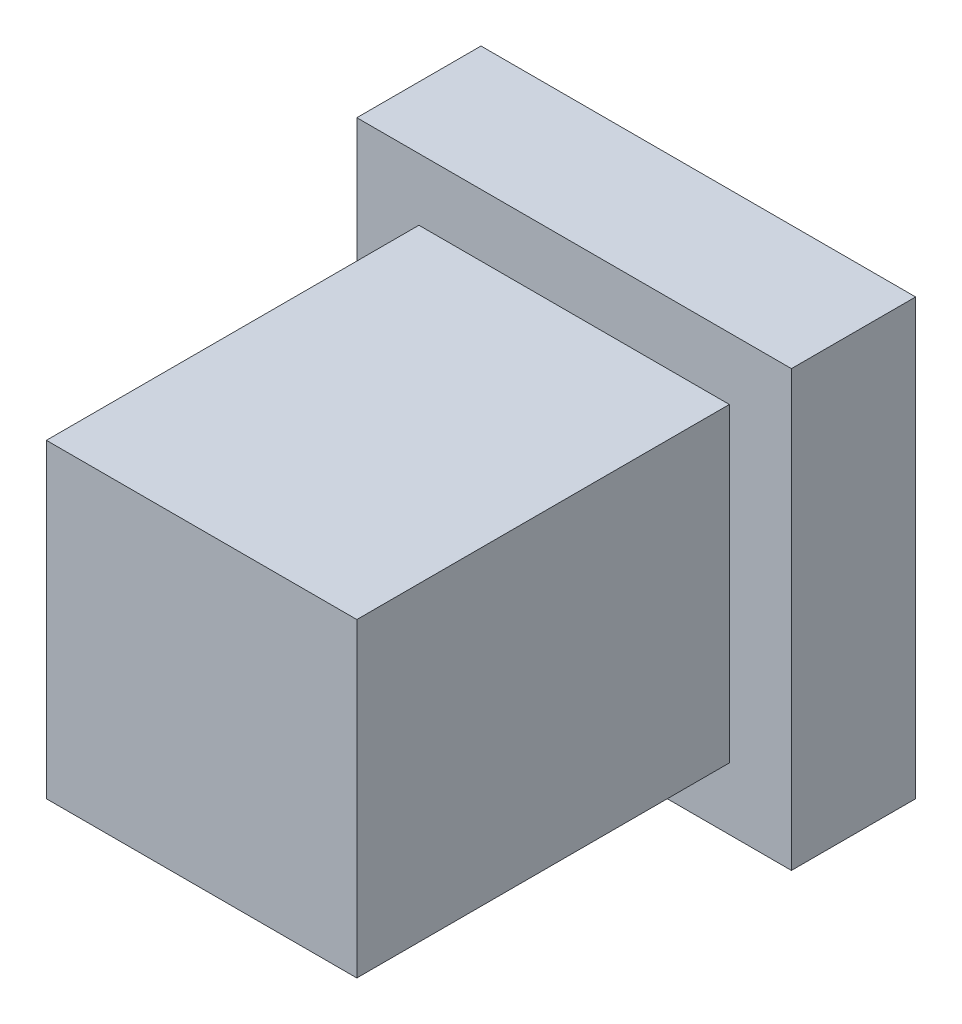
ISO-10303-21;
HEADER;
FILE_DESCRIPTION(('STEP AP214'),'2;1');
FILE_NAME('part.step','',(''),(''),'','','');
FILE_SCHEMA(('AUTOMOTIVE_DESIGN { 1 0 10303 214 1 1 1 1 }'));
ENDSEC;
DATA;
#1=APPLICATION_CONTEXT('core data for automotive mechanical design processes');
#2=APPLICATION_PROTOCOL_DEFINITION('international standard','automotive_design',2000,#1);
#3=PRODUCT_CONTEXT('',#1,'mechanical');
#4=PRODUCT('Part','Part','',(#3));
#5=PRODUCT_RELATED_PRODUCT_CATEGORY('part','',(#4));
#6=PRODUCT_DEFINITION_FORMATION('','',#4);
#7=PRODUCT_DEFINITION_CONTEXT('part definition',#1,'design');
#8=PRODUCT_DEFINITION('design','',#6,#7);
#9=PRODUCT_DEFINITION_SHAPE('','',#8);
#10=(LENGTH_UNIT() NAMED_UNIT(*) SI_UNIT(.MILLI.,.METRE.));
#11=(NAMED_UNIT(*) PLANE_ANGLE_UNIT() SI_UNIT($,.RADIAN.));
#12=(NAMED_UNIT(*) SI_UNIT($,.STERADIAN.) SOLID_ANGLE_UNIT());
#13=UNCERTAINTY_MEASURE_WITH_UNIT(LENGTH_MEASURE(1.E-05),#10,'distance_accuracy_value','');
#14=(GEOMETRIC_REPRESENTATION_CONTEXT(3) GLOBAL_UNCERTAINTY_ASSIGNED_CONTEXT((#13)) GLOBAL_UNIT_ASSIGNED_CONTEXT((#10,
#11,#12)) REPRESENTATION_CONTEXT('',''));
#15=CARTESIAN_POINT('',(0.,0.,0.));
#16=DIRECTION('',(0.,0.,1.));
#17=DIRECTION('',(1.,0.,0.));
#18=AXIS2_PLACEMENT_3D('',#15,#16,#17);
#19=CARTESIAN_POINT('',(2.5,-2.5,8.));
#20=DIRECTION('',(-1.,0.,0.));
#21=DIRECTION('',(0.,-1.,0.));
#22=AXIS2_PLACEMENT_3D('',#19,#20,#21);
#23=PLANE('',#22);
#24=DIRECTION('',(0.,0.,-1.));
#25=VECTOR('',#24,1.);
#26=CARTESIAN_POINT('',(2.5,-2.5,8.));
#27=LINE('',#26,#25);
#28=CARTESIAN_POINT('',(2.5,-2.5,8.));
#29=VERTEX_POINT('',#28);
#30=CARTESIAN_POINT('',(2.5,-2.5,2.));
#31=VERTEX_POINT('',#30);
#32=EDGE_CURVE('E161',#29,#31,#27,.T.);
#33=ORIENTED_EDGE('',*,*,#32,.T.);
#34=DIRECTION('',(0.,1.,0.));
#35=VECTOR('',#34,1.);
#36=CARTESIAN_POINT('',(2.5,-2.5,2.));
#37=LINE('',#36,#35);
#38=CARTESIAN_POINT('',(2.5,2.5,2.));
#39=VERTEX_POINT('',#38);
#40=EDGE_CURVE('E51',#31,#39,#37,.T.);
#41=ORIENTED_EDGE('',*,*,#40,.T.);
#42=DIRECTION('',(0.,0.,-1.));
#43=VECTOR('',#42,1.);
#44=CARTESIAN_POINT('',(2.5,2.5,8.));
#45=LINE('',#44,#43);
#46=CARTESIAN_POINT('',(2.5,2.5,8.));
#47=VERTEX_POINT('',#46);
#48=EDGE_CURVE('E44',#47,#39,#45,.T.);
#49=ORIENTED_EDGE('',*,*,#48,.F.);
#50=DIRECTION('',(0.,1.,0.));
#51=VECTOR('',#50,1.);
#52=CARTESIAN_POINT('',(2.5,-2.5,8.));
#53=LINE('',#52,#51);
#54=EDGE_CURVE('E154',#29,#47,#53,.T.);
#55=ORIENTED_EDGE('',*,*,#54,.F.);
#56=EDGE_LOOP('',(#33,#41,#49,#55));
#57=FACE_BOUND('',#56,.T.);
#58=ADVANCED_FACE('F37',(#57),#23,.F.);
#59=CARTESIAN_POINT('',(-2.5,2.5,8.));
#60=DIRECTION('',(0.,-1.,0.));
#61=DIRECTION('',(1.,0.,0.));
#62=AXIS2_PLACEMENT_3D('',#59,#60,#61);
#63=PLANE('',#62);
#64=ORIENTED_EDGE('',*,*,#48,.T.);
#65=DIRECTION('',(-1.,0.,0.));
#66=VECTOR('',#65,1.);
#67=CARTESIAN_POINT('',(-2.5,2.5,2.));
#68=LINE('',#67,#66);
#69=CARTESIAN_POINT('',(-2.5,2.5,2.));
#70=VERTEX_POINT('',#69);
#71=EDGE_CURVE('E150',#39,#70,#68,.T.);
#72=ORIENTED_EDGE('',*,*,#71,.T.);
#73=DIRECTION('',(0.,0.,-1.));
#74=VECTOR('',#73,1.);
#75=CARTESIAN_POINT('',(-2.5,2.5,8.));
#76=LINE('',#75,#74);
#77=CARTESIAN_POINT('',(-2.5,2.5,8.));
#78=VERTEX_POINT('',#77);
#79=EDGE_CURVE('E167',#78,#70,#76,.T.);
#80=ORIENTED_EDGE('',*,*,#79,.F.);
#81=DIRECTION('',(-1.,0.,0.));
#82=VECTOR('',#81,1.);
#83=CARTESIAN_POINT('',(-2.5,2.5,8.));
#84=LINE('',#83,#82);
#85=EDGE_CURVE('E156',#47,#78,#84,.T.);
#86=ORIENTED_EDGE('',*,*,#85,.F.);
#87=EDGE_LOOP('',(#64,#72,#80,#86));
#88=FACE_BOUND('',#87,.T.);
#89=ADVANCED_FACE('F172',(#88),#63,.F.);
#90=CARTESIAN_POINT('',(-2.5,-2.5,8.));
#91=DIRECTION('',(1.,0.,0.));
#92=DIRECTION('',(0.,0.,-1.));
#93=AXIS2_PLACEMENT_3D('',#90,#91,#92);
#94=PLANE('',#93);
#95=ORIENTED_EDGE('',*,*,#79,.T.);
#96=DIRECTION('',(0.,-1.,0.));
#97=VECTOR('',#96,1.);
#98=CARTESIAN_POINT('',(-2.5,-2.5,2.));
#99=LINE('',#98,#97);
#100=CARTESIAN_POINT('',(-2.5,-2.5,2.));
#101=VERTEX_POINT('',#100);
#102=EDGE_CURVE('E144',#70,#101,#99,.T.);
#103=ORIENTED_EDGE('',*,*,#102,.T.);
#104=DIRECTION('',(0.,0.,-1.));
#105=VECTOR('',#104,1.);
#106=CARTESIAN_POINT('',(-2.5,-2.5,8.));
#107=LINE('',#106,#105);
#108=CARTESIAN_POINT('',(-2.5,-2.5,8.));
#109=VERTEX_POINT('',#108);
#110=EDGE_CURVE('E164',#109,#101,#107,.T.);
#111=ORIENTED_EDGE('',*,*,#110,.F.);
#112=DIRECTION('',(0.,-1.,0.));
#113=VECTOR('',#112,1.);
#114=CARTESIAN_POINT('',(-2.5,-2.5,8.));
#115=LINE('',#114,#113);
#116=EDGE_CURVE('E158',#78,#109,#115,.T.);
#117=ORIENTED_EDGE('',*,*,#116,.F.);
#118=EDGE_LOOP('',(#95,#103,#111,#117));
#119=FACE_BOUND('',#118,.T.);
#120=ADVANCED_FACE('F180',(#119),#94,.F.);
#121=CARTESIAN_POINT('',(-2.5,-2.5,8.));
#122=DIRECTION('',(0.,1.,0.));
#123=DIRECTION('',(-1.,0.,0.));
#124=AXIS2_PLACEMENT_3D('',#121,#122,#123);
#125=PLANE('',#124);
#126=ORIENTED_EDGE('',*,*,#110,.T.);
#127=DIRECTION('',(1.,0.,0.));
#128=VECTOR('',#127,1.);
#129=CARTESIAN_POINT('',(-2.5,-2.5,2.));
#130=LINE('',#129,#128);
#131=EDGE_CURVE('E11',#101,#31,#130,.T.);
#132=ORIENTED_EDGE('',*,*,#131,.T.);
#133=ORIENTED_EDGE('',*,*,#32,.F.);
#134=DIRECTION('',(1.,0.,0.));
#135=VECTOR('',#134,1.);
#136=CARTESIAN_POINT('',(-2.5,-2.5,8.));
#137=LINE('',#136,#135);
#138=EDGE_CURVE('E58',#109,#29,#137,.T.);
#139=ORIENTED_EDGE('',*,*,#138,.F.);
#140=EDGE_LOOP('',(#126,#132,#133,#139));
#141=FACE_BOUND('',#140,.T.);
#142=ADVANCED_FACE('F177',(#141),#125,.F.);
#143=CARTESIAN_POINT('',(0.,0.,8.));
#144=DIRECTION('',(0.,0.,-1.));
#145=DIRECTION('',(-1.,0.,0.));
#146=AXIS2_PLACEMENT_3D('',#143,#144,#145);
#147=PLANE('',#146);
#148=ORIENTED_EDGE('',*,*,#54,.T.);
#149=ORIENTED_EDGE('',*,*,#85,.T.);
#150=ORIENTED_EDGE('',*,*,#116,.T.);
#151=ORIENTED_EDGE('',*,*,#138,.T.);
#152=EDGE_LOOP('',(#148,#149,#150,#151));
#153=FACE_BOUND('',#152,.T.);
#154=ADVANCED_FACE('F182',(#153),#147,.F.);
#155=CARTESIAN_POINT('',(0.,0.,2.));
#156=DIRECTION('',(0.,0.,1.));
#157=DIRECTION('',(1.,0.,0.));
#158=AXIS2_PLACEMENT_3D('',#155,#156,#157);
#159=PLANE('',#158);
#160=DIRECTION('',(0.,1.,0.));
#161=VECTOR('',#160,1.);
#162=CARTESIAN_POINT('',(-3.5,-3.5,2.));
#163=LINE('',#162,#161);
#164=CARTESIAN_POINT('',(-3.5,-3.5,2.));
#165=VERTEX_POINT('',#164);
#166=CARTESIAN_POINT('',(-3.5,3.5,2.));
#167=VERTEX_POINT('',#166);
#168=EDGE_CURVE('E119',#165,#167,#163,.T.);
#169=ORIENTED_EDGE('',*,*,#168,.F.);
#170=DIRECTION('',(-1.,0.,0.));
#171=VECTOR('',#170,1.);
#172=CARTESIAN_POINT('',(3.5,-3.5,2.));
#173=LINE('',#172,#171);
#174=CARTESIAN_POINT('',(3.5,-3.5,2.));
#175=VERTEX_POINT('',#174);
#176=EDGE_CURVE('E112',#175,#165,#173,.T.);
#177=ORIENTED_EDGE('',*,*,#176,.F.);
#178=DIRECTION('',(0.,-1.,0.));
#179=VECTOR('',#178,1.);
#180=CARTESIAN_POINT('',(3.5,-3.5,2.));
#181=LINE('',#180,#179);
#182=CARTESIAN_POINT('',(3.5,3.5,2.));
#183=VERTEX_POINT('',#182);
#184=EDGE_CURVE('E122',#183,#175,#181,.T.);
#185=ORIENTED_EDGE('',*,*,#184,.F.);
#186=DIRECTION('',(1.,0.,0.));
#187=VECTOR('',#186,1.);
#188=CARTESIAN_POINT('',(3.5,3.5,2.));
#189=LINE('',#188,#187);
#190=EDGE_CURVE('E104',#167,#183,#189,.T.);
#191=ORIENTED_EDGE('',*,*,#190,.F.);
#192=EDGE_LOOP('',(#169,#177,#185,#191));
#193=FACE_BOUND('',#192,.T.);
#194=ORIENTED_EDGE('',*,*,#40,.F.);
#195=ORIENTED_EDGE('',*,*,#131,.F.);
#196=ORIENTED_EDGE('',*,*,#102,.F.);
#197=ORIENTED_EDGE('',*,*,#71,.F.);
#198=EDGE_LOOP('',(#194,#195,#196,#197));
#199=FACE_BOUND('',#198,.T.);
#200=ADVANCED_FACE('F117',(#193,#199),#159,.T.);
#201=CARTESIAN_POINT('',(-3.5,-3.5,2.));
#202=DIRECTION('',(-1.,0.,0.));
#203=DIRECTION('',(0.,-1.,0.));
#204=AXIS2_PLACEMENT_3D('',#201,#202,#203);
#205=PLANE('',#204);
#206=DIRECTION('',(0.,1.,0.));
#207=VECTOR('',#206,1.);
#208=CARTESIAN_POINT('',(-3.5,-3.5,0.));
#209=LINE('',#208,#207);
#210=CARTESIAN_POINT('',(-3.5,-3.5,0.));
#211=VERTEX_POINT('',#210);
#212=CARTESIAN_POINT('',(-3.5,3.5,0.));
#213=VERTEX_POINT('',#212);
#214=EDGE_CURVE('E137',#211,#213,#209,.T.);
#215=ORIENTED_EDGE('',*,*,#214,.F.);
#216=DIRECTION('',(0.,0.,-1.));
#217=VECTOR('',#216,1.);
#218=CARTESIAN_POINT('',(-3.5,-3.5,2.));
#219=LINE('',#218,#217);
#220=EDGE_CURVE('E125',#165,#211,#219,.T.);
#221=ORIENTED_EDGE('',*,*,#220,.F.);
#222=ORIENTED_EDGE('',*,*,#168,.T.);
#223=DIRECTION('',(0.,0.,-1.));
#224=VECTOR('',#223,1.);
#225=CARTESIAN_POINT('',(-3.5,3.5,2.));
#226=LINE('',#225,#224);
#227=EDGE_CURVE('E101',#167,#213,#226,.T.);
#228=ORIENTED_EDGE('',*,*,#227,.T.);
#229=EDGE_LOOP('',(#215,#221,#222,#228));
#230=FACE_BOUND('',#229,.T.);
#231=ADVANCED_FACE('F124',(#230),#205,.T.);
#232=CARTESIAN_POINT('',(3.5,-3.5,2.));
#233=DIRECTION('',(0.,-1.,0.));
#234=DIRECTION('',(0.,0.,-1.));
#235=AXIS2_PLACEMENT_3D('',#232,#233,#234);
#236=PLANE('',#235);
#237=DIRECTION('',(-1.,0.,0.));
#238=VECTOR('',#237,1.);
#239=CARTESIAN_POINT('',(3.5,-3.5,0.));
#240=LINE('',#239,#238);
#241=CARTESIAN_POINT('',(3.5,-3.5,0.));
#242=VERTEX_POINT('',#241);
#243=EDGE_CURVE('E126',#242,#211,#240,.T.);
#244=ORIENTED_EDGE('',*,*,#243,.F.);
#245=DIRECTION('',(0.,0.,-1.));
#246=VECTOR('',#245,1.);
#247=CARTESIAN_POINT('',(3.5,-3.5,2.));
#248=LINE('',#247,#246);
#249=EDGE_CURVE('E145',#175,#242,#248,.T.);
#250=ORIENTED_EDGE('',*,*,#249,.F.);
#251=ORIENTED_EDGE('',*,*,#176,.T.);
#252=ORIENTED_EDGE('',*,*,#220,.T.);
#253=EDGE_LOOP('',(#244,#250,#251,#252));
#254=FACE_BOUND('',#253,.T.);
#255=ADVANCED_FACE('F220',(#254),#236,.T.);
#256=CARTESIAN_POINT('',(3.5,-3.5,2.));
#257=DIRECTION('',(1.,0.,0.));
#258=DIRECTION('',(0.,1.,0.));
#259=AXIS2_PLACEMENT_3D('',#256,#257,#258);
#260=PLANE('',#259);
#261=DIRECTION('',(0.,-1.,0.));
#262=VECTOR('',#261,1.);
#263=CARTESIAN_POINT('',(3.5,-3.5,0.));
#264=LINE('',#263,#262);
#265=CARTESIAN_POINT('',(3.5,3.5,0.));
#266=VERTEX_POINT('',#265);
#267=EDGE_CURVE('E129',#266,#242,#264,.T.);
#268=ORIENTED_EDGE('',*,*,#267,.F.);
#269=DIRECTION('',(0.,0.,-1.));
#270=VECTOR('',#269,1.);
#271=CARTESIAN_POINT('',(3.5,3.5,2.));
#272=LINE('',#271,#270);
#273=EDGE_CURVE('E111',#183,#266,#272,.T.);
#274=ORIENTED_EDGE('',*,*,#273,.F.);
#275=ORIENTED_EDGE('',*,*,#184,.T.);
#276=ORIENTED_EDGE('',*,*,#249,.T.);
#277=EDGE_LOOP('',(#268,#274,#275,#276));
#278=FACE_BOUND('',#277,.T.);
#279=ADVANCED_FACE('F212',(#278),#260,.T.);
#280=CARTESIAN_POINT('',(3.5,3.5,2.));
#281=DIRECTION('',(0.,1.,0.));
#282=DIRECTION('',(0.,0.,1.));
#283=AXIS2_PLACEMENT_3D('',#280,#281,#282);
#284=PLANE('',#283);
#285=DIRECTION('',(1.,0.,0.));
#286=VECTOR('',#285,1.);
#287=CARTESIAN_POINT('',(3.5,3.5,0.));
#288=LINE('',#287,#286);
#289=EDGE_CURVE('E106',#213,#266,#288,.T.);
#290=ORIENTED_EDGE('',*,*,#289,.F.);
#291=ORIENTED_EDGE('',*,*,#227,.F.);
#292=ORIENTED_EDGE('',*,*,#190,.T.);
#293=ORIENTED_EDGE('',*,*,#273,.T.);
#294=EDGE_LOOP('',(#290,#291,#292,#293));
#295=FACE_BOUND('',#294,.T.);
#296=ADVANCED_FACE('F103',(#295),#284,.T.);
#297=CARTESIAN_POINT('',(0.,0.,0.));
#298=DIRECTION('',(0.,0.,-1.));
#299=DIRECTION('',(-1.,0.,0.));
#300=AXIS2_PLACEMENT_3D('',#297,#298,#299);
#301=PLANE('',#300);
#302=CARTESIAN_POINT('',(0.,0.,0.));
#303=DIRECTION('',(0.,0.,-1.));
#304=DIRECTION('',(-1.,0.,0.));
#305=AXIS2_PLACEMENT_3D('',#302,#303,#304);
#306=CIRCLE('',#305,1.5);
#307=CARTESIAN_POINT('',(-1.5,0.,0.));
#308=VERTEX_POINT('',#307);
#309=EDGE_CURVE('E132',#308,#308,#306,.T.);
#310=ORIENTED_EDGE('',*,*,#309,.F.);
#311=EDGE_LOOP('',(#310));
#312=FACE_BOUND('',#311,.T.);
#313=ORIENTED_EDGE('',*,*,#214,.T.);
#314=ORIENTED_EDGE('',*,*,#289,.T.);
#315=ORIENTED_EDGE('',*,*,#267,.T.);
#316=ORIENTED_EDGE('',*,*,#243,.T.);
#317=EDGE_LOOP('',(#313,#314,#315,#316));
#318=FACE_BOUND('',#317,.T.);
#319=ADVANCED_FACE('F201',(#312,#318),#301,.T.);
#320=CARTESIAN_POINT('',(0.,0.,5.));
#321=DIRECTION('',(0.,0.,-1.));
#322=DIRECTION('',(-1.,0.,0.));
#323=AXIS2_PLACEMENT_3D('',#320,#321,#322);
#324=CYLINDRICAL_SURFACE('',#323,1.5);
#325=CARTESIAN_POINT('',(0.,0.,5.));
#326=DIRECTION('',(0.,0.,-1.));
#327=DIRECTION('',(-1.,0.,0.));
#328=AXIS2_PLACEMENT_3D('',#325,#326,#327);
#329=CIRCLE('',#328,1.5);
#330=CARTESIAN_POINT('',(-1.5,0.,5.));
#331=VERTEX_POINT('',#330);
#332=EDGE_CURVE('E139',#331,#331,#329,.T.);
#333=ORIENTED_EDGE('',*,*,#332,.F.);
#334=EDGE_LOOP('',(#333));
#335=FACE_BOUND('',#334,.T.);
#336=ORIENTED_EDGE('',*,*,#309,.T.);
#337=EDGE_LOOP('',(#336));
#338=FACE_BOUND('',#337,.T.);
#339=ADVANCED_FACE('F203',(#335,#338),#324,.F.);
#340=CARTESIAN_POINT('',(0.,0.,5.));
#341=DIRECTION('',(0.,0.,-1.));
#342=DIRECTION('',(-1.,0.,0.));
#343=AXIS2_PLACEMENT_3D('',#340,#341,#342);
#344=PLANE('',#343);
#345=ORIENTED_EDGE('',*,*,#332,.T.);
#346=EDGE_LOOP('',(#345));
#347=FACE_BOUND('',#346,.T.);
#348=ADVANCED_FACE('F209',(#347),#344,.T.);
#349=CLOSED_SHELL('',(#58,#89,#120,#142,#154,#200,#231,#255,#279,#296,#319,#339,#348));
#350=MANIFOLD_SOLID_BREP('B2',#349);
#351=ADVANCED_BREP_SHAPE_REPRESENTATION('',(#18,#350),#14);
#352=SHAPE_DEFINITION_REPRESENTATION(#9,#351);
ENDSEC;
END-ISO-10303-21;
